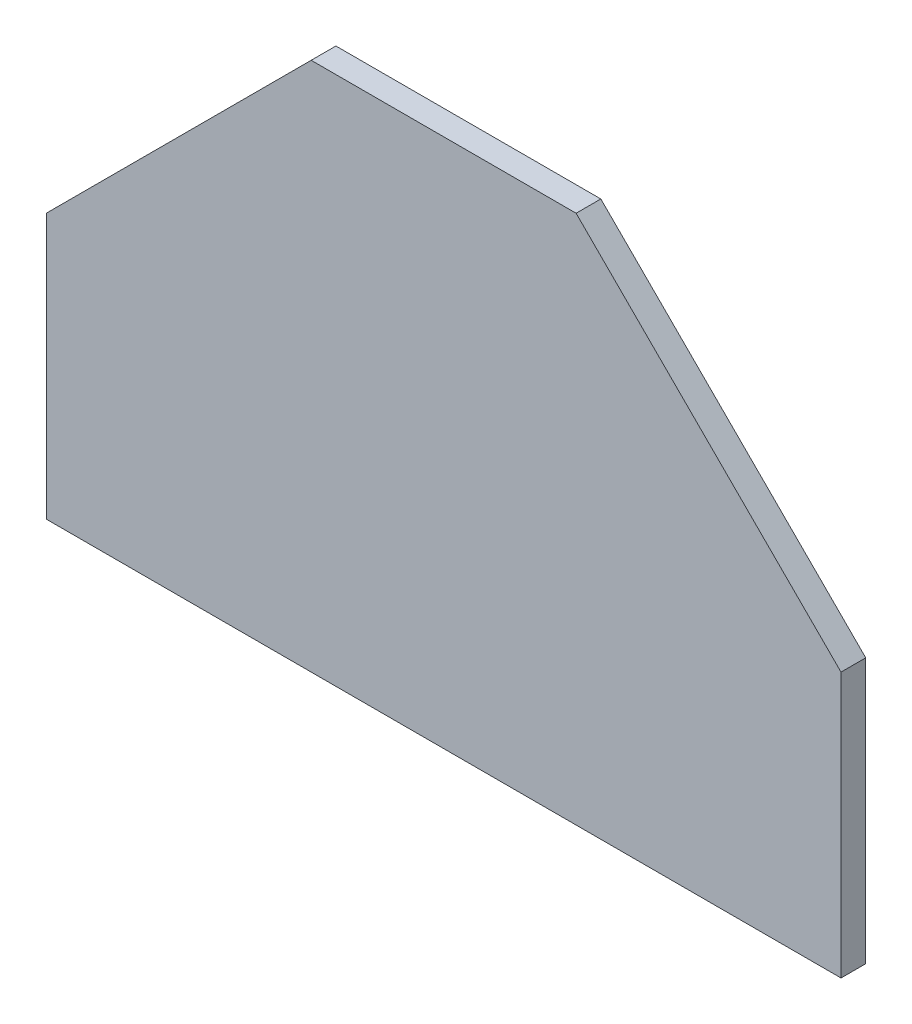
ISO-10303-21;
HEADER;
FILE_DESCRIPTION(('STEP AP214'),'2;1');
FILE_NAME('part.step','',(''),(''),'','','');
FILE_SCHEMA(('AUTOMOTIVE_DESIGN { 1 0 10303 214 1 1 1 1 }'));
ENDSEC;
DATA;
#1=APPLICATION_CONTEXT('core data for automotive mechanical design processes');
#2=APPLICATION_PROTOCOL_DEFINITION('international standard','automotive_design',2000,#1);
#3=PRODUCT_CONTEXT('',#1,'mechanical');
#4=PRODUCT('Part','Part','',(#3));
#5=PRODUCT_RELATED_PRODUCT_CATEGORY('part','',(#4));
#6=PRODUCT_DEFINITION_FORMATION('','',#4);
#7=PRODUCT_DEFINITION_CONTEXT('part definition',#1,'design');
#8=PRODUCT_DEFINITION('design','',#6,#7);
#9=PRODUCT_DEFINITION_SHAPE('','',#8);
#10=(LENGTH_UNIT() NAMED_UNIT(*) SI_UNIT(.MILLI.,.METRE.));
#11=(NAMED_UNIT(*) PLANE_ANGLE_UNIT() SI_UNIT($,.RADIAN.));
#12=(NAMED_UNIT(*) SI_UNIT($,.STERADIAN.) SOLID_ANGLE_UNIT());
#13=UNCERTAINTY_MEASURE_WITH_UNIT(LENGTH_MEASURE(1.E-05),#10,'distance_accuracy_value','');
#14=(GEOMETRIC_REPRESENTATION_CONTEXT(3) GLOBAL_UNCERTAINTY_ASSIGNED_CONTEXT((#13)) GLOBAL_UNIT_ASSIGNED_CONTEXT((#10,
#11,#12)) REPRESENTATION_CONTEXT('',''));
#15=CARTESIAN_POINT('',(0.,0.,0.));
#16=DIRECTION('',(0.,0.,1.));
#17=DIRECTION('',(1.,0.,0.));
#18=AXIS2_PLACEMENT_3D('',#15,#16,#17);
#19=CARTESIAN_POINT('',(-16.7439427891767,11.6489630385949,3.556));
#20=DIRECTION('',(-1.,0.,0.));
#21=DIRECTION('',(0.,0.,1.));
#22=AXIS2_PLACEMENT_3D('',#19,#20,#21);
#23=PLANE('',#22);
#24=DIRECTION('',(0.,1.,0.));
#25=VECTOR('',#24,1.);
#26=CARTESIAN_POINT('',(-16.7439427891767,11.6489630385949,0.));
#27=LINE('',#26,#25);
#28=CARTESIAN_POINT('',(-16.7439427891767,11.6489630385949,0.));
#29=VERTEX_POINT('',#28);
#30=CARTESIAN_POINT('',(-16.7439427891767,49.7489630385949,0.));
#31=VERTEX_POINT('',#30);
#32=EDGE_CURVE('E120',#29,#31,#27,.T.);
#33=ORIENTED_EDGE('',*,*,#32,.F.);
#34=DIRECTION('',(0.,0.,-1.));
#35=VECTOR('',#34,1.);
#36=CARTESIAN_POINT('',(-16.7439427891767,11.6489630385949,3.556));
#37=LINE('',#36,#35);
#38=CARTESIAN_POINT('',(-16.7439427891767,11.6489630385949,3.556));
#39=VERTEX_POINT('',#38);
#40=EDGE_CURVE('E11',#39,#29,#37,.T.);
#41=ORIENTED_EDGE('',*,*,#40,.F.);
#42=DIRECTION('',(0.,1.,0.));
#43=VECTOR('',#42,1.);
#44=CARTESIAN_POINT('',(-16.7439427891767,11.6489630385949,3.556));
#45=LINE('',#44,#43);
#46=CARTESIAN_POINT('',(-16.7439427891767,49.7489630385949,3.556));
#47=VERTEX_POINT('',#46);
#48=EDGE_CURVE('E132',#39,#47,#45,.T.);
#49=ORIENTED_EDGE('',*,*,#48,.T.);
#50=DIRECTION('',(0.,0.,-1.));
#51=VECTOR('',#50,1.);
#52=CARTESIAN_POINT('',(-16.7439427891767,49.7489630385949,3.556));
#53=LINE('',#52,#51);
#54=EDGE_CURVE('E36',#47,#31,#53,.T.);
#55=ORIENTED_EDGE('',*,*,#54,.T.);
#56=EDGE_LOOP('',(#33,#41,#49,#55));
#57=FACE_BOUND('',#56,.T.);
#58=ADVANCED_FACE('F33',(#57),#23,.T.);
#59=CARTESIAN_POINT('',(-16.7439427891767,11.6489630385949,3.556));
#60=DIRECTION('',(0.,1.,0.));
#61=DIRECTION('',(0.,0.,1.));
#62=AXIS2_PLACEMENT_3D('',#59,#60,#61);
#63=PLANE('',#62);
#64=DIRECTION('',(1.,0.,0.));
#65=VECTOR('',#64,1.);
#66=CARTESIAN_POINT('',(-16.7439427891767,11.6489630385949,0.));
#67=LINE('',#66,#65);
#68=CARTESIAN_POINT('',(97.5560572108233,11.6489630385949,0.));
#69=VERTEX_POINT('',#68);
#70=EDGE_CURVE('E72',#29,#69,#67,.T.);
#71=ORIENTED_EDGE('',*,*,#70,.T.);
#72=DIRECTION('',(0.,0.,-1.));
#73=VECTOR('',#72,1.);
#74=CARTESIAN_POINT('',(97.5560572108233,11.6489630385949,3.556));
#75=LINE('',#74,#73);
#76=CARTESIAN_POINT('',(97.5560572108233,11.6489630385949,3.556));
#77=VERTEX_POINT('',#76);
#78=EDGE_CURVE('E42',#77,#69,#75,.T.);
#79=ORIENTED_EDGE('',*,*,#78,.F.);
#80=DIRECTION('',(1.,0.,0.));
#81=VECTOR('',#80,1.);
#82=CARTESIAN_POINT('',(-16.7439427891767,11.6489630385949,3.556));
#83=LINE('',#82,#81);
#84=EDGE_CURVE('E99',#39,#77,#83,.T.);
#85=ORIENTED_EDGE('',*,*,#84,.F.);
#86=ORIENTED_EDGE('',*,*,#40,.T.);
#87=EDGE_LOOP('',(#71,#79,#85,#86));
#88=FACE_BOUND('',#87,.T.);
#89=ADVANCED_FACE('F151',(#88),#63,.F.);
#90=CARTESIAN_POINT('',(97.5560572108233,11.6489630385949,3.556));
#91=DIRECTION('',(-1.,0.,0.));
#92=DIRECTION('',(0.,-1.,0.));
#93=AXIS2_PLACEMENT_3D('',#90,#91,#92);
#94=PLANE('',#93);
#95=DIRECTION('',(0.,1.,0.));
#96=VECTOR('',#95,1.);
#97=CARTESIAN_POINT('',(97.5560572108233,11.6489630385949,0.));
#98=LINE('',#97,#96);
#99=CARTESIAN_POINT('',(97.5560572108233,49.7489630385949,0.));
#100=VERTEX_POINT('',#99);
#101=EDGE_CURVE('E106',#69,#100,#98,.T.);
#102=ORIENTED_EDGE('',*,*,#101,.T.);
#103=DIRECTION('',(0.,0.,-1.));
#104=VECTOR('',#103,1.);
#105=CARTESIAN_POINT('',(97.5560572108233,49.7489630385949,3.556));
#106=LINE('',#105,#104);
#107=CARTESIAN_POINT('',(97.5560572108233,49.7489630385949,3.556));
#108=VERTEX_POINT('',#107);
#109=EDGE_CURVE('E103',#108,#100,#106,.T.);
#110=ORIENTED_EDGE('',*,*,#109,.F.);
#111=DIRECTION('',(0.,1.,0.));
#112=VECTOR('',#111,1.);
#113=CARTESIAN_POINT('',(97.5560572108233,11.6489630385949,3.556));
#114=LINE('',#113,#112);
#115=EDGE_CURVE('E91',#77,#108,#114,.T.);
#116=ORIENTED_EDGE('',*,*,#115,.F.);
#117=ORIENTED_EDGE('',*,*,#78,.T.);
#118=EDGE_LOOP('',(#102,#110,#116,#117));
#119=FACE_BOUND('',#118,.T.);
#120=ADVANCED_FACE('F104',(#119),#94,.F.);
#121=CARTESIAN_POINT('',(59.4560572108233,87.8489630385949,3.556));
#122=DIRECTION('',(0.707106781186547,0.707106781186548,0.));
#123=DIRECTION('',(-0.707106781186548,0.707106781186547,0.));
#124=AXIS2_PLACEMENT_3D('',#121,#122,#123);
#125=PLANE('',#124);
#126=DIRECTION('',(0.707106781186548,-0.707106781186547,0.));
#127=VECTOR('',#126,1.);
#128=CARTESIAN_POINT('',(59.4560572108233,87.8489630385949,0.));
#129=LINE('',#128,#127);
#130=CARTESIAN_POINT('',(59.4560572108233,87.8489630385949,0.));
#131=VERTEX_POINT('',#130);
#132=EDGE_CURVE('E129',#131,#100,#129,.T.);
#133=ORIENTED_EDGE('',*,*,#132,.F.);
#134=DIRECTION('',(0.,0.,-1.));
#135=VECTOR('',#134,1.);
#136=CARTESIAN_POINT('',(59.4560572108233,87.8489630385949,3.556));
#137=LINE('',#136,#135);
#138=CARTESIAN_POINT('',(59.4560572108233,87.8489630385949,3.556));
#139=VERTEX_POINT('',#138);
#140=EDGE_CURVE('E110',#139,#131,#137,.T.);
#141=ORIENTED_EDGE('',*,*,#140,.F.);
#142=DIRECTION('',(0.707106781186548,-0.707106781186547,0.));
#143=VECTOR('',#142,1.);
#144=CARTESIAN_POINT('',(59.4560572108233,87.8489630385949,3.556));
#145=LINE('',#144,#143);
#146=EDGE_CURVE('E97',#139,#108,#145,.T.);
#147=ORIENTED_EDGE('',*,*,#146,.T.);
#148=ORIENTED_EDGE('',*,*,#109,.T.);
#149=EDGE_LOOP('',(#133,#141,#147,#148));
#150=FACE_BOUND('',#149,.T.);
#151=ADVANCED_FACE('F112',(#150),#125,.T.);
#152=CARTESIAN_POINT('',(21.3560572108233,87.8489630385949,3.556));
#153=DIRECTION('',(0.,1.,0.));
#154=DIRECTION('',(0.,0.,1.));
#155=AXIS2_PLACEMENT_3D('',#152,#153,#154);
#156=PLANE('',#155);
#157=DIRECTION('',(1.,0.,0.));
#158=VECTOR('',#157,1.);
#159=CARTESIAN_POINT('',(21.3560572108233,87.8489630385949,0.));
#160=LINE('',#159,#158);
#161=CARTESIAN_POINT('',(21.3560572108233,87.8489630385949,0.));
#162=VERTEX_POINT('',#161);
#163=EDGE_CURVE('E126',#162,#131,#160,.T.);
#164=ORIENTED_EDGE('',*,*,#163,.F.);
#165=DIRECTION('',(0.,0.,-1.));
#166=VECTOR('',#165,1.);
#167=CARTESIAN_POINT('',(21.3560572108233,87.8489630385949,3.556));
#168=LINE('',#167,#166);
#169=CARTESIAN_POINT('',(21.3560572108233,87.8489630385949,3.556));
#170=VERTEX_POINT('',#169);
#171=EDGE_CURVE('E135',#170,#162,#168,.T.);
#172=ORIENTED_EDGE('',*,*,#171,.F.);
#173=DIRECTION('',(1.,0.,0.));
#174=VECTOR('',#173,1.);
#175=CARTESIAN_POINT('',(21.3560572108233,87.8489630385949,3.556));
#176=LINE('',#175,#174);
#177=EDGE_CURVE('E113',#170,#139,#176,.T.);
#178=ORIENTED_EDGE('',*,*,#177,.T.);
#179=ORIENTED_EDGE('',*,*,#140,.T.);
#180=EDGE_LOOP('',(#164,#172,#178,#179));
#181=FACE_BOUND('',#180,.T.);
#182=ADVANCED_FACE('F141',(#181),#156,.T.);
#183=CARTESIAN_POINT('',(-16.7439427891767,49.7489630385949,3.556));
#184=DIRECTION('',(-0.707106781186547,0.707106781186547,0.));
#185=DIRECTION('',(-0.707106781186548,-0.707106781186548,0.));
#186=AXIS2_PLACEMENT_3D('',#183,#184,#185);
#187=PLANE('',#186);
#188=DIRECTION('',(0.707106781186547,0.707106781186547,0.));
#189=VECTOR('',#188,1.);
#190=CARTESIAN_POINT('',(-16.7439427891767,49.7489630385949,0.));
#191=LINE('',#190,#189);
#192=EDGE_CURVE('E123',#31,#162,#191,.T.);
#193=ORIENTED_EDGE('',*,*,#192,.F.);
#194=ORIENTED_EDGE('',*,*,#54,.F.);
#195=DIRECTION('',(0.707106781186547,0.707106781186547,0.));
#196=VECTOR('',#195,1.);
#197=CARTESIAN_POINT('',(-16.7439427891767,49.7489630385949,3.556));
#198=LINE('',#197,#196);
#199=EDGE_CURVE('E115',#47,#170,#198,.T.);
#200=ORIENTED_EDGE('',*,*,#199,.T.);
#201=ORIENTED_EDGE('',*,*,#171,.T.);
#202=EDGE_LOOP('',(#193,#194,#200,#201));
#203=FACE_BOUND('',#202,.T.);
#204=ADVANCED_FACE('F137',(#203),#187,.T.);
#205=CARTESIAN_POINT('',(0.,0.,3.556));
#206=DIRECTION('',(0.,0.,-1.));
#207=DIRECTION('',(-1.,0.,0.));
#208=AXIS2_PLACEMENT_3D('',#205,#206,#207);
#209=PLANE('',#208);
#210=ORIENTED_EDGE('',*,*,#48,.F.);
#211=ORIENTED_EDGE('',*,*,#84,.T.);
#212=ORIENTED_EDGE('',*,*,#115,.T.);
#213=ORIENTED_EDGE('',*,*,#146,.F.);
#214=ORIENTED_EDGE('',*,*,#177,.F.);
#215=ORIENTED_EDGE('',*,*,#199,.F.);
#216=EDGE_LOOP('',(#210,#211,#212,#213,#214,#215));
#217=FACE_BOUND('',#216,.T.);
#218=ADVANCED_FACE('F94',(#217),#209,.F.);
#219=CARTESIAN_POINT('',(0.,0.,0.));
#220=DIRECTION('',(0.,0.,-1.));
#221=DIRECTION('',(-1.,0.,0.));
#222=AXIS2_PLACEMENT_3D('',#219,#220,#221);
#223=PLANE('',#222);
#224=ORIENTED_EDGE('',*,*,#32,.T.);
#225=ORIENTED_EDGE('',*,*,#192,.T.);
#226=ORIENTED_EDGE('',*,*,#163,.T.);
#227=ORIENTED_EDGE('',*,*,#132,.T.);
#228=ORIENTED_EDGE('',*,*,#101,.F.);
#229=ORIENTED_EDGE('',*,*,#70,.F.);
#230=EDGE_LOOP('',(#224,#225,#226,#227,#228,#229));
#231=FACE_BOUND('',#230,.T.);
#232=ADVANCED_FACE('F139',(#231),#223,.T.);
#233=CLOSED_SHELL('',(#58,#89,#120,#151,#182,#204,#218,#232));
#234=MANIFOLD_SOLID_BREP('B2',#233);
#235=ADVANCED_BREP_SHAPE_REPRESENTATION('',(#18,#234),#14);
#236=SHAPE_DEFINITION_REPRESENTATION(#9,#235);
ENDSEC;
END-ISO-10303-21;
